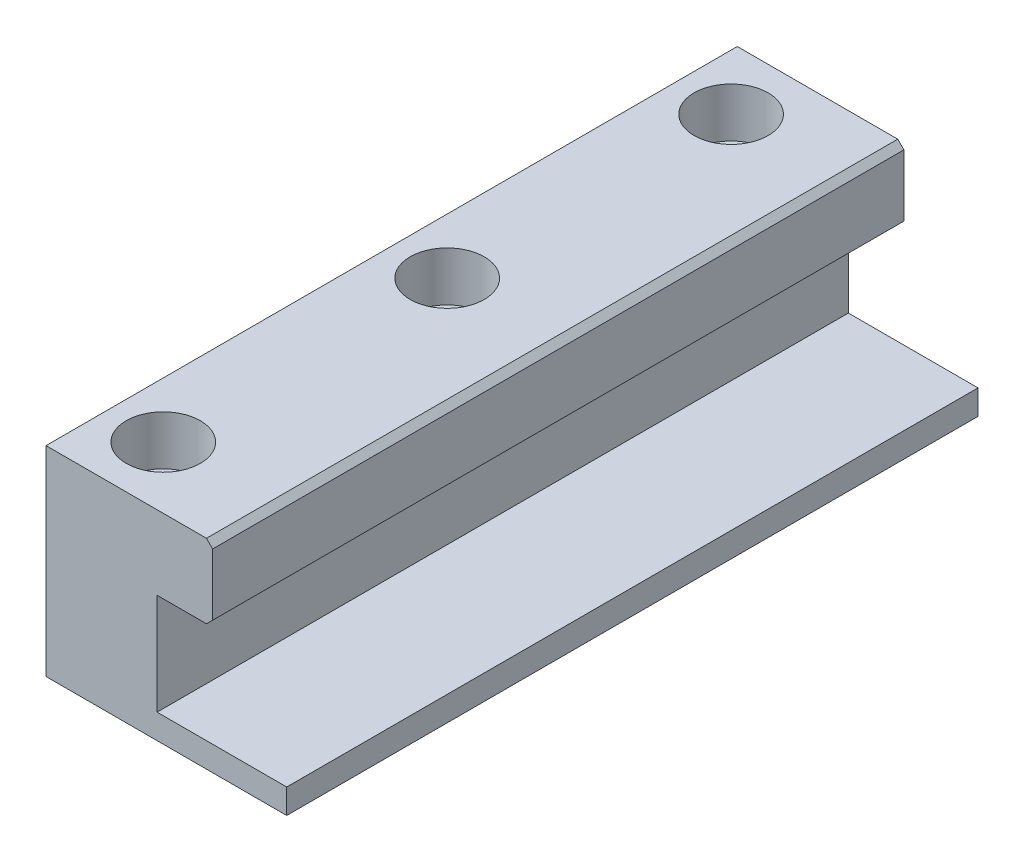
ISO-10303-21;
HEADER;
FILE_DESCRIPTION(('STEP AP214'),'2;1');
FILE_NAME('part.step','',(''),(''),'','','');
FILE_SCHEMA(('AUTOMOTIVE_DESIGN { 1 0 10303 214 1 1 1 1 }'));
ENDSEC;
DATA;
#1=APPLICATION_CONTEXT('core data for automotive mechanical design processes');
#2=APPLICATION_PROTOCOL_DEFINITION('international standard','automotive_design',2000,#1);
#3=PRODUCT_CONTEXT('',#1,'mechanical');
#4=PRODUCT('Part','Part','',(#3));
#5=PRODUCT_RELATED_PRODUCT_CATEGORY('part','',(#4));
#6=PRODUCT_DEFINITION_FORMATION('','',#4);
#7=PRODUCT_DEFINITION_CONTEXT('part definition',#1,'design');
#8=PRODUCT_DEFINITION('design','',#6,#7);
#9=PRODUCT_DEFINITION_SHAPE('','',#8);
#10=(LENGTH_UNIT() NAMED_UNIT(*) SI_UNIT(.MILLI.,.METRE.));
#11=(NAMED_UNIT(*) PLANE_ANGLE_UNIT() SI_UNIT($,.RADIAN.));
#12=(NAMED_UNIT(*) SI_UNIT($,.STERADIAN.) SOLID_ANGLE_UNIT());
#13=UNCERTAINTY_MEASURE_WITH_UNIT(LENGTH_MEASURE(1.E-05),#10,'distance_accuracy_value','');
#14=(GEOMETRIC_REPRESENTATION_CONTEXT(3) GLOBAL_UNCERTAINTY_ASSIGNED_CONTEXT((#13)) GLOBAL_UNIT_ASSIGNED_CONTEXT((#10,
#11,#12)) REPRESENTATION_CONTEXT('',''));
#15=CARTESIAN_POINT('',(0.,0.,0.));
#16=DIRECTION('',(0.,0.,1.));
#17=DIRECTION('',(1.,0.,0.));
#18=AXIS2_PLACEMENT_3D('',#15,#16,#17);
#19=CARTESIAN_POINT('',(13.25,15.95,0.));
#20=DIRECTION('',(0.707106781186546,0.707106781186549,0.));
#21=DIRECTION('',(-0.707106781186549,0.707106781186546,0.));
#22=AXIS2_PLACEMENT_3D('',#19,#20,#21);
#23=PLANE('',#22);
#24=DIRECTION('',(-0.707106781186549,0.707106781186546,0.));
#25=VECTOR('',#24,1.);
#26=CARTESIAN_POINT('',(13.25,15.95,28.));
#27=LINE('',#26,#25);
#28=CARTESIAN_POINT('',(13.,16.2,28.));
#29=VERTEX_POINT('',#28);
#30=CARTESIAN_POINT('',(13.5,15.7,28.));
#31=VERTEX_POINT('',#30);
#32=EDGE_CURVE('E140',#29,#31,#27,.F.);
#33=ORIENTED_EDGE('',*,*,#32,.T.);
#34=DIRECTION('',(0.,0.,-1.));
#35=VECTOR('',#34,1.);
#36=CARTESIAN_POINT('',(13.5,15.7,0.));
#37=LINE('',#36,#35);
#38=CARTESIAN_POINT('',(13.5,15.7,-28.));
#39=VERTEX_POINT('',#38);
#40=EDGE_CURVE('E111',#39,#31,#37,.F.);
#41=ORIENTED_EDGE('',*,*,#40,.F.);
#42=DIRECTION('',(-0.707106781186549,0.707106781186546,0.));
#43=VECTOR('',#42,1.);
#44=CARTESIAN_POINT('',(13.25,15.95,-28.));
#45=LINE('',#44,#43);
#46=CARTESIAN_POINT('',(13.,16.2,-28.));
#47=VERTEX_POINT('',#46);
#48=EDGE_CURVE('E142',#39,#47,#45,.T.);
#49=ORIENTED_EDGE('',*,*,#48,.T.);
#50=DIRECTION('',(0.,0.,1.));
#51=VECTOR('',#50,1.);
#52=CARTESIAN_POINT('',(13.,16.2,0.));
#53=LINE('',#52,#51);
#54=EDGE_CURVE('E135',#29,#47,#53,.F.);
#55=ORIENTED_EDGE('',*,*,#54,.F.);
#56=EDGE_LOOP('',(#33,#41,#49,#55));
#57=FACE_BOUND('',#56,.T.);
#58=ADVANCED_FACE('F17',(#57),#23,.T.);
#59=CARTESIAN_POINT('',(13.25,10.45,0.));
#60=DIRECTION('',(0.707106781186548,-0.707106781186548,0.));
#61=DIRECTION('',(0.707106781186548,0.707106781186548,0.));
#62=AXIS2_PLACEMENT_3D('',#59,#60,#61);
#63=PLANE('',#62);
#64=DIRECTION('',(0.707106781186548,0.707106781186548,0.));
#65=VECTOR('',#64,1.);
#66=CARTESIAN_POINT('',(13.25,10.45,28.));
#67=LINE('',#66,#65);
#68=CARTESIAN_POINT('',(13.5,10.7,28.));
#69=VERTEX_POINT('',#68);
#70=CARTESIAN_POINT('',(13.,10.2,28.));
#71=VERTEX_POINT('',#70);
#72=EDGE_CURVE('E92',#69,#71,#67,.F.);
#73=ORIENTED_EDGE('',*,*,#72,.T.);
#74=DIRECTION('',(0.,0.,-1.));
#75=VECTOR('',#74,1.);
#76=CARTESIAN_POINT('',(13.,10.2,0.));
#77=LINE('',#76,#75);
#78=CARTESIAN_POINT('',(13.,10.2,-28.));
#79=VERTEX_POINT('',#78);
#80=EDGE_CURVE('E132',#79,#71,#77,.F.);
#81=ORIENTED_EDGE('',*,*,#80,.F.);
#82=DIRECTION('',(0.707106781186548,0.707106781186548,0.));
#83=VECTOR('',#82,1.);
#84=CARTESIAN_POINT('',(13.25,10.45,-28.));
#85=LINE('',#84,#83);
#86=CARTESIAN_POINT('',(13.5,10.7,-28.));
#87=VERTEX_POINT('',#86);
#88=EDGE_CURVE('E104',#79,#87,#85,.T.);
#89=ORIENTED_EDGE('',*,*,#88,.T.);
#90=DIRECTION('',(0.,0.,-1.));
#91=VECTOR('',#90,1.);
#92=CARTESIAN_POINT('',(13.5,10.7,0.));
#93=LINE('',#92,#91);
#94=EDGE_CURVE('E103',#69,#87,#93,.T.);
#95=ORIENTED_EDGE('',*,*,#94,.F.);
#96=EDGE_LOOP('',(#73,#81,#89,#95));
#97=FACE_BOUND('',#96,.T.);
#98=ADVANCED_FACE('F107',(#97),#63,.T.);
#99=CARTESIAN_POINT('',(4.5,14.2,-23.));
#100=DIRECTION('',(0.,1.,0.));
#101=DIRECTION('',(-1.,0.,0.));
#102=AXIS2_PLACEMENT_3D('',#99,#100,#101);
#103=CYLINDRICAL_SURFACE('',#102,3.);
#104=CARTESIAN_POINT('',(4.5,12.2,-23.));
#105=DIRECTION('',(0.,1.,0.));
#106=DIRECTION('',(-1.,0.,0.));
#107=AXIS2_PLACEMENT_3D('',#104,#105,#106);
#108=CIRCLE('',#107,3.);
#109=CARTESIAN_POINT('',(1.5,12.2,-23.));
#110=VERTEX_POINT('',#109);
#111=EDGE_CURVE('E128',#110,#110,#108,.T.);
#112=ORIENTED_EDGE('',*,*,#111,.F.);
#113=EDGE_LOOP('',(#112));
#114=FACE_BOUND('',#113,.T.);
#115=CARTESIAN_POINT('',(4.5,16.2,-23.));
#116=DIRECTION('',(0.,1.,0.));
#117=DIRECTION('',(-1.,0.,0.));
#118=AXIS2_PLACEMENT_3D('',#115,#116,#117);
#119=CIRCLE('',#118,3.);
#120=CARTESIAN_POINT('',(1.5,16.2,-23.));
#121=VERTEX_POINT('',#120);
#122=EDGE_CURVE('E20',#121,#121,#119,.F.);
#123=ORIENTED_EDGE('',*,*,#122,.F.);
#124=EDGE_LOOP('',(#123));
#125=FACE_BOUND('',#124,.T.);
#126=ADVANCED_FACE('F176',(#114,#125),#103,.F.);
#127=CARTESIAN_POINT('',(4.5,14.2,0.));
#128=DIRECTION('',(0.,1.,0.));
#129=DIRECTION('',(-1.,0.,0.));
#130=AXIS2_PLACEMENT_3D('',#127,#128,#129);
#131=CYLINDRICAL_SURFACE('',#130,3.);
#132=CARTESIAN_POINT('',(4.5,12.2,0.));
#133=DIRECTION('',(0.,1.,0.));
#134=DIRECTION('',(-1.,0.,0.));
#135=AXIS2_PLACEMENT_3D('',#132,#133,#134);
#136=CIRCLE('',#135,3.);
#137=CARTESIAN_POINT('',(1.5,12.2,0.));
#138=VERTEX_POINT('',#137);
#139=EDGE_CURVE('E122',#138,#138,#136,.T.);
#140=ORIENTED_EDGE('',*,*,#139,.F.);
#141=EDGE_LOOP('',(#140));
#142=FACE_BOUND('',#141,.T.);
#143=CARTESIAN_POINT('',(4.5,16.2,0.));
#144=DIRECTION('',(0.,1.,0.));
#145=DIRECTION('',(-1.,0.,0.));
#146=AXIS2_PLACEMENT_3D('',#143,#144,#145);
#147=CIRCLE('',#146,3.);
#148=CARTESIAN_POINT('',(1.5,16.2,0.));
#149=VERTEX_POINT('',#148);
#150=EDGE_CURVE('E166',#149,#149,#147,.F.);
#151=ORIENTED_EDGE('',*,*,#150,.F.);
#152=EDGE_LOOP('',(#151));
#153=FACE_BOUND('',#152,.T.);
#154=ADVANCED_FACE('F178',(#142,#153),#131,.F.);
#155=CARTESIAN_POINT('',(4.5,14.2,23.));
#156=DIRECTION('',(0.,1.,0.));
#157=DIRECTION('',(-1.,0.,0.));
#158=AXIS2_PLACEMENT_3D('',#155,#156,#157);
#159=CYLINDRICAL_SURFACE('',#158,3.);
#160=CARTESIAN_POINT('',(4.5,12.2,23.));
#161=DIRECTION('',(0.,1.,0.));
#162=DIRECTION('',(-1.,0.,0.));
#163=AXIS2_PLACEMENT_3D('',#160,#161,#162);
#164=CIRCLE('',#163,3.);
#165=CARTESIAN_POINT('',(1.5,12.2,23.));
#166=VERTEX_POINT('',#165);
#167=EDGE_CURVE('E117',#166,#166,#164,.T.);
#168=ORIENTED_EDGE('',*,*,#167,.F.);
#169=EDGE_LOOP('',(#168));
#170=FACE_BOUND('',#169,.T.);
#171=CARTESIAN_POINT('',(4.5,16.2,23.));
#172=DIRECTION('',(0.,1.,0.));
#173=DIRECTION('',(-1.,0.,0.));
#174=AXIS2_PLACEMENT_3D('',#171,#172,#173);
#175=CIRCLE('',#174,3.);
#176=CARTESIAN_POINT('',(1.5,16.2,23.));
#177=VERTEX_POINT('',#176);
#178=EDGE_CURVE('E134',#177,#177,#175,.F.);
#179=ORIENTED_EDGE('',*,*,#178,.F.);
#180=EDGE_LOOP('',(#179));
#181=FACE_BOUND('',#180,.T.);
#182=ADVANCED_FACE('F186',(#170,#181),#159,.F.);
#183=CARTESIAN_POINT('',(13.5,16.2,0.));
#184=DIRECTION('',(1.,0.,0.));
#185=DIRECTION('',(0.,0.,-1.));
#186=AXIS2_PLACEMENT_3D('',#183,#184,#185);
#187=PLANE('',#186);
#188=ORIENTED_EDGE('',*,*,#40,.T.);
#189=DIRECTION('',(0.,1.,0.));
#190=VECTOR('',#189,1.);
#191=CARTESIAN_POINT('',(13.5,6.81641791044776,28.));
#192=LINE('',#191,#190);
#193=EDGE_CURVE('E100',#69,#31,#192,.T.);
#194=ORIENTED_EDGE('',*,*,#193,.F.);
#195=ORIENTED_EDGE('',*,*,#94,.T.);
#196=DIRECTION('',(0.,1.,0.));
#197=VECTOR('',#196,1.);
#198=CARTESIAN_POINT('',(13.5,6.81641791044776,-28.));
#199=LINE('',#198,#197);
#200=EDGE_CURVE('E400',#87,#39,#199,.T.);
#201=ORIENTED_EDGE('',*,*,#200,.T.);
#202=EDGE_LOOP('',(#188,#194,#195,#201));
#203=FACE_BOUND('',#202,.T.);
#204=ADVANCED_FACE('F114',(#203),#187,.T.);
#205=CARTESIAN_POINT('',(0.,16.2,0.));
#206=DIRECTION('',(0.,1.,0.));
#207=DIRECTION('',(0.,0.,1.));
#208=AXIS2_PLACEMENT_3D('',#205,#206,#207);
#209=PLANE('',#208);
#210=ORIENTED_EDGE('',*,*,#178,.T.);
#211=EDGE_LOOP('',(#210));
#212=FACE_BOUND('',#211,.T.);
#213=ORIENTED_EDGE('',*,*,#150,.T.);
#214=EDGE_LOOP('',(#213));
#215=FACE_BOUND('',#214,.T.);
#216=ORIENTED_EDGE('',*,*,#122,.T.);
#217=EDGE_LOOP('',(#216));
#218=FACE_BOUND('',#217,.T.);
#219=DIRECTION('',(0.,0.,1.));
#220=VECTOR('',#219,1.);
#221=CARTESIAN_POINT('',(0.,16.2,0.));
#222=LINE('',#221,#220);
#223=CARTESIAN_POINT('',(0.,16.2,28.));
#224=VERTEX_POINT('',#223);
#225=CARTESIAN_POINT('',(0.,16.2,-28.));
#226=VERTEX_POINT('',#225);
#227=EDGE_CURVE('E396',#224,#226,#222,.F.);
#228=ORIENTED_EDGE('',*,*,#227,.F.);
#229=DIRECTION('',(1.,0.,0.));
#230=VECTOR('',#229,1.);
#231=CARTESIAN_POINT('',(8.39925373134329,16.2,28.));
#232=LINE('',#231,#230);
#233=EDGE_CURVE('E116',#29,#224,#232,.F.);
#234=ORIENTED_EDGE('',*,*,#233,.F.);
#235=ORIENTED_EDGE('',*,*,#54,.T.);
#236=DIRECTION('',(1.,0.,0.));
#237=VECTOR('',#236,1.);
#238=CARTESIAN_POINT('',(8.39925373134328,16.2,-28.));
#239=LINE('',#238,#237);
#240=EDGE_CURVE('E398',#47,#226,#239,.F.);
#241=ORIENTED_EDGE('',*,*,#240,.T.);
#242=EDGE_LOOP('',(#228,#234,#235,#241));
#243=FACE_BOUND('',#242,.T.);
#244=ADVANCED_FACE('F173',(#212,#215,#218,#243),#209,.T.);
#245=CARTESIAN_POINT('',(9.,10.2,0.));
#246=DIRECTION('',(1.,0.,0.));
#247=DIRECTION('',(0.,0.,-1.));
#248=AXIS2_PLACEMENT_3D('',#245,#246,#247);
#249=PLANE('',#248);
#250=DIRECTION('',(0.,1.,0.));
#251=VECTOR('',#250,1.);
#252=CARTESIAN_POINT('',(9.,6.81641791044776,-28.));
#253=LINE('',#252,#251);
#254=CARTESIAN_POINT('',(9.,2.,-28.));
#255=VERTEX_POINT('',#254);
#256=CARTESIAN_POINT('',(9.,10.2,-28.));
#257=VERTEX_POINT('',#256);
#258=EDGE_CURVE('E420',#255,#257,#253,.T.);
#259=ORIENTED_EDGE('',*,*,#258,.T.);
#260=DIRECTION('',(0.,0.,-1.));
#261=VECTOR('',#260,1.);
#262=CARTESIAN_POINT('',(9.,10.2,0.));
#263=LINE('',#262,#261);
#264=CARTESIAN_POINT('',(9.,10.2,28.));
#265=VERTEX_POINT('',#264);
#266=EDGE_CURVE('E129',#265,#257,#263,.T.);
#267=ORIENTED_EDGE('',*,*,#266,.F.);
#268=DIRECTION('',(0.,1.,0.));
#269=VECTOR('',#268,1.);
#270=CARTESIAN_POINT('',(9.,6.81641791044776,28.));
#271=LINE('',#270,#269);
#272=CARTESIAN_POINT('',(9.,2.,28.));
#273=VERTEX_POINT('',#272);
#274=EDGE_CURVE('E406',#273,#265,#271,.T.);
#275=ORIENTED_EDGE('',*,*,#274,.F.);
#276=DIRECTION('',(0.,0.,1.));
#277=VECTOR('',#276,1.);
#278=CARTESIAN_POINT('',(9.,2.,0.));
#279=LINE('',#278,#277);
#280=EDGE_CURVE('E126',#255,#273,#279,.T.);
#281=ORIENTED_EDGE('',*,*,#280,.F.);
#282=EDGE_LOOP('',(#259,#267,#275,#281));
#283=FACE_BOUND('',#282,.T.);
#284=ADVANCED_FACE('F242',(#283),#249,.T.);
#285=CARTESIAN_POINT('',(13.5,10.2,0.));
#286=DIRECTION('',(0.,-1.,0.));
#287=DIRECTION('',(0.,0.,-1.));
#288=AXIS2_PLACEMENT_3D('',#285,#286,#287);
#289=PLANE('',#288);
#290=ORIENTED_EDGE('',*,*,#266,.T.);
#291=DIRECTION('',(1.,0.,0.));
#292=VECTOR('',#291,1.);
#293=CARTESIAN_POINT('',(8.39925373134328,10.2,-28.));
#294=LINE('',#293,#292);
#295=EDGE_CURVE('E423',#257,#79,#294,.T.);
#296=ORIENTED_EDGE('',*,*,#295,.T.);
#297=ORIENTED_EDGE('',*,*,#80,.T.);
#298=DIRECTION('',(1.,0.,0.));
#299=VECTOR('',#298,1.);
#300=CARTESIAN_POINT('',(8.39925373134329,10.2,28.));
#301=LINE('',#300,#299);
#302=EDGE_CURVE('E102',#265,#71,#301,.T.);
#303=ORIENTED_EDGE('',*,*,#302,.F.);
#304=EDGE_LOOP('',(#290,#296,#297,#303));
#305=FACE_BOUND('',#304,.T.);
#306=ADVANCED_FACE('F238',(#305),#289,.T.);
#307=CARTESIAN_POINT('',(9.,2.,0.));
#308=DIRECTION('',(0.,1.,0.));
#309=DIRECTION('',(0.,0.,1.));
#310=AXIS2_PLACEMENT_3D('',#307,#308,#309);
#311=PLANE('',#310);
#312=DIRECTION('',(1.,0.,0.));
#313=VECTOR('',#312,1.);
#314=CARTESIAN_POINT('',(8.39925373134328,2.,-28.));
#315=LINE('',#314,#313);
#316=CARTESIAN_POINT('',(19.5,2.,-28.));
#317=VERTEX_POINT('',#316);
#318=EDGE_CURVE('E418',#317,#255,#315,.F.);
#319=ORIENTED_EDGE('',*,*,#318,.T.);
#320=ORIENTED_EDGE('',*,*,#280,.T.);
#321=DIRECTION('',(1.,0.,0.));
#322=VECTOR('',#321,1.);
#323=CARTESIAN_POINT('',(8.39925373134329,2.,28.));
#324=LINE('',#323,#322);
#325=CARTESIAN_POINT('',(19.5,2.,28.));
#326=VERTEX_POINT('',#325);
#327=EDGE_CURVE('E119',#326,#273,#324,.F.);
#328=ORIENTED_EDGE('',*,*,#327,.F.);
#329=DIRECTION('',(0.,0.,-1.));
#330=VECTOR('',#329,1.);
#331=CARTESIAN_POINT('',(19.5,2.,0.));
#332=LINE('',#331,#330);
#333=EDGE_CURVE('E159',#317,#326,#332,.F.);
#334=ORIENTED_EDGE('',*,*,#333,.F.);
#335=EDGE_LOOP('',(#319,#320,#328,#334));
#336=FACE_BOUND('',#335,.T.);
#337=ADVANCED_FACE('F234',(#336),#311,.T.);
#338=CARTESIAN_POINT('',(4.5,12.2,-23.));
#339=DIRECTION('',(0.,1.,0.));
#340=DIRECTION('',(0.,0.,1.));
#341=AXIS2_PLACEMENT_3D('',#338,#339,#340);
#342=PLANE('',#341);
#343=CARTESIAN_POINT('',(4.5,12.2,-23.));
#344=DIRECTION('',(0.,1.,0.));
#345=DIRECTION('',(-1.,0.,0.));
#346=AXIS2_PLACEMENT_3D('',#343,#344,#345);
#347=CIRCLE('',#346,1.75);
#348=CARTESIAN_POINT('',(2.75,12.2,-23.));
#349=VERTEX_POINT('',#348);
#350=EDGE_CURVE('E157',#349,#349,#347,.F.);
#351=ORIENTED_EDGE('',*,*,#350,.T.);
#352=EDGE_LOOP('',(#351));
#353=FACE_BOUND('',#352,.T.);
#354=ORIENTED_EDGE('',*,*,#111,.T.);
#355=EDGE_LOOP('',(#354));
#356=FACE_BOUND('',#355,.T.);
#357=ADVANCED_FACE('F230',(#353,#356),#342,.T.);
#358=CARTESIAN_POINT('',(4.5,12.2,0.));
#359=DIRECTION('',(0.,1.,0.));
#360=DIRECTION('',(0.,0.,1.));
#361=AXIS2_PLACEMENT_3D('',#358,#359,#360);
#362=PLANE('',#361);
#363=CARTESIAN_POINT('',(4.5,12.2,0.));
#364=DIRECTION('',(0.,1.,0.));
#365=DIRECTION('',(-1.,0.,0.));
#366=AXIS2_PLACEMENT_3D('',#363,#364,#365);
#367=CIRCLE('',#366,1.75);
#368=CARTESIAN_POINT('',(2.75,12.2,0.));
#369=VERTEX_POINT('',#368);
#370=EDGE_CURVE('E154',#369,#369,#367,.F.);
#371=ORIENTED_EDGE('',*,*,#370,.T.);
#372=EDGE_LOOP('',(#371));
#373=FACE_BOUND('',#372,.T.);
#374=ORIENTED_EDGE('',*,*,#139,.T.);
#375=EDGE_LOOP('',(#374));
#376=FACE_BOUND('',#375,.T.);
#377=ADVANCED_FACE('F226',(#373,#376),#362,.T.);
#378=CARTESIAN_POINT('',(4.5,12.2,23.));
#379=DIRECTION('',(0.,1.,0.));
#380=DIRECTION('',(0.,0.,1.));
#381=AXIS2_PLACEMENT_3D('',#378,#379,#380);
#382=PLANE('',#381);
#383=CARTESIAN_POINT('',(4.5,12.2,23.));
#384=DIRECTION('',(0.,1.,0.));
#385=DIRECTION('',(-1.,0.,0.));
#386=AXIS2_PLACEMENT_3D('',#383,#384,#385);
#387=CIRCLE('',#386,1.75);
#388=CARTESIAN_POINT('',(2.75,12.2,23.));
#389=VERTEX_POINT('',#388);
#390=EDGE_CURVE('E150',#389,#389,#387,.F.);
#391=ORIENTED_EDGE('',*,*,#390,.T.);
#392=EDGE_LOOP('',(#391));
#393=FACE_BOUND('',#392,.T.);
#394=ORIENTED_EDGE('',*,*,#167,.T.);
#395=EDGE_LOOP('',(#394));
#396=FACE_BOUND('',#395,.T.);
#397=ADVANCED_FACE('F223',(#393,#396),#382,.T.);
#398=CARTESIAN_POINT('',(8.39925373134329,6.81641791044776,28.));
#399=DIRECTION('',(0.,0.,1.));
#400=DIRECTION('',(1.,0.,0.));
#401=AXIS2_PLACEMENT_3D('',#398,#399,#400);
#402=PLANE('',#401);
#403=ORIENTED_EDGE('',*,*,#274,.T.);
#404=ORIENTED_EDGE('',*,*,#302,.T.);
#405=ORIENTED_EDGE('',*,*,#72,.F.);
#406=ORIENTED_EDGE('',*,*,#193,.T.);
#407=ORIENTED_EDGE('',*,*,#32,.F.);
#408=ORIENTED_EDGE('',*,*,#233,.T.);
#409=DIRECTION('',(0.,1.,0.));
#410=VECTOR('',#409,1.);
#411=CARTESIAN_POINT('',(0.,0.,28.));
#412=LINE('',#411,#410);
#413=CARTESIAN_POINT('',(0.,0.,28.));
#414=VERTEX_POINT('',#413);
#415=EDGE_CURVE('E393',#414,#224,#412,.T.);
#416=ORIENTED_EDGE('',*,*,#415,.F.);
#417=DIRECTION('',(1.,0.,0.));
#418=VECTOR('',#417,1.);
#419=CARTESIAN_POINT('',(19.5,0.,28.));
#420=LINE('',#419,#418);
#421=CARTESIAN_POINT('',(19.5,0.,28.));
#422=VERTEX_POINT('',#421);
#423=EDGE_CURVE('E153',#422,#414,#420,.F.);
#424=ORIENTED_EDGE('',*,*,#423,.F.);
#425=DIRECTION('',(0.,1.,0.));
#426=VECTOR('',#425,1.);
#427=CARTESIAN_POINT('',(19.5,2.,28.));
#428=LINE('',#427,#426);
#429=EDGE_CURVE('E414',#326,#422,#428,.F.);
#430=ORIENTED_EDGE('',*,*,#429,.F.);
#431=ORIENTED_EDGE('',*,*,#327,.T.);
#432=EDGE_LOOP('',(#403,#404,#405,#406,#407,#408,#416,#424,#430,#431));
#433=FACE_BOUND('',#432,.T.);
#434=ADVANCED_FACE('F98',(#433),#402,.T.);
#435=CARTESIAN_POINT('',(0.,0.,0.));
#436=DIRECTION('',(-1.,0.,0.));
#437=DIRECTION('',(0.,0.,1.));
#438=AXIS2_PLACEMENT_3D('',#435,#436,#437);
#439=PLANE('',#438);
#440=DIRECTION('',(0.,1.,0.));
#441=VECTOR('',#440,1.);
#442=CARTESIAN_POINT('',(0.,6.81641791044776,-28.));
#443=LINE('',#442,#441);
#444=CARTESIAN_POINT('',(0.,0.,-28.));
#445=VERTEX_POINT('',#444);
#446=EDGE_CURVE('E430',#226,#445,#443,.F.);
#447=ORIENTED_EDGE('',*,*,#446,.T.);
#448=DIRECTION('',(0.,0.,-1.));
#449=VECTOR('',#448,1.);
#450=CARTESIAN_POINT('',(0.,0.,0.));
#451=LINE('',#450,#449);
#452=EDGE_CURVE('E403',#414,#445,#451,.T.);
#453=ORIENTED_EDGE('',*,*,#452,.F.);
#454=ORIENTED_EDGE('',*,*,#415,.T.);
#455=ORIENTED_EDGE('',*,*,#227,.T.);
#456=EDGE_LOOP('',(#447,#453,#454,#455));
#457=FACE_BOUND('',#456,.T.);
#458=ADVANCED_FACE('F217',(#457),#439,.T.);
#459=CARTESIAN_POINT('',(8.39925373134328,6.81641791044776,-28.));
#460=DIRECTION('',(0.,0.,1.));
#461=DIRECTION('',(1.,0.,0.));
#462=AXIS2_PLACEMENT_3D('',#459,#460,#461);
#463=PLANE('',#462);
#464=ORIENTED_EDGE('',*,*,#295,.F.);
#465=ORIENTED_EDGE('',*,*,#258,.F.);
#466=ORIENTED_EDGE('',*,*,#318,.F.);
#467=DIRECTION('',(0.,1.,0.));
#468=VECTOR('',#467,1.);
#469=CARTESIAN_POINT('',(19.5,2.,-28.));
#470=LINE('',#469,#468);
#471=CARTESIAN_POINT('',(19.5,0.,-28.));
#472=VERTEX_POINT('',#471);
#473=EDGE_CURVE('E35',#472,#317,#470,.T.);
#474=ORIENTED_EDGE('',*,*,#473,.F.);
#475=DIRECTION('',(1.,0.,0.));
#476=VECTOR('',#475,1.);
#477=CARTESIAN_POINT('',(19.5,0.,-28.));
#478=LINE('',#477,#476);
#479=EDGE_CURVE('E433',#445,#472,#478,.T.);
#480=ORIENTED_EDGE('',*,*,#479,.F.);
#481=ORIENTED_EDGE('',*,*,#446,.F.);
#482=ORIENTED_EDGE('',*,*,#240,.F.);
#483=ORIENTED_EDGE('',*,*,#48,.F.);
#484=ORIENTED_EDGE('',*,*,#200,.F.);
#485=ORIENTED_EDGE('',*,*,#88,.F.);
#486=EDGE_LOOP('',(#464,#465,#466,#474,#480,#481,#482,#483,#484,#485));
#487=FACE_BOUND('',#486,.T.);
#488=ADVANCED_FACE('F213',(#487),#463,.F.);
#489=CARTESIAN_POINT('',(19.5,2.,0.));
#490=DIRECTION('',(1.,0.,0.));
#491=DIRECTION('',(0.,0.,-1.));
#492=AXIS2_PLACEMENT_3D('',#489,#490,#491);
#493=PLANE('',#492);
#494=ORIENTED_EDGE('',*,*,#473,.T.);
#495=ORIENTED_EDGE('',*,*,#333,.T.);
#496=ORIENTED_EDGE('',*,*,#429,.T.);
#497=DIRECTION('',(0.,0.,-1.));
#498=VECTOR('',#497,1.);
#499=CARTESIAN_POINT('',(19.5,0.,0.));
#500=LINE('',#499,#498);
#501=EDGE_CURVE('E149',#472,#422,#500,.F.);
#502=ORIENTED_EDGE('',*,*,#501,.F.);
#503=EDGE_LOOP('',(#494,#495,#496,#502));
#504=FACE_BOUND('',#503,.T.);
#505=ADVANCED_FACE('F209',(#504),#493,.T.);
#506=CARTESIAN_POINT('',(4.49999999999999,-45.2710500967732,-23.));
#507=DIRECTION('',(0.,1.,0.));
#508=DIRECTION('',(-1.,0.,0.));
#509=AXIS2_PLACEMENT_3D('',#506,#507,#508);
#510=CYLINDRICAL_SURFACE('',#509,1.75);
#511=ORIENTED_EDGE('',*,*,#350,.F.);
#512=EDGE_LOOP('',(#511));
#513=FACE_BOUND('',#512,.T.);
#514=CARTESIAN_POINT('',(4.5,0.,-23.));
#515=DIRECTION('',(0.,1.,0.));
#516=DIRECTION('',(-1.,0.,0.));
#517=AXIS2_PLACEMENT_3D('',#514,#515,#516);
#518=CIRCLE('',#517,1.75);
#519=CARTESIAN_POINT('',(2.75,0.,-23.));
#520=VERTEX_POINT('',#519);
#521=EDGE_CURVE('E146',#520,#520,#518,.T.);
#522=ORIENTED_EDGE('',*,*,#521,.F.);
#523=EDGE_LOOP('',(#522));
#524=FACE_BOUND('',#523,.T.);
#525=ADVANCED_FACE('F205',(#513,#524),#510,.F.);
#526=CARTESIAN_POINT('',(4.49999999999999,-45.2710500967732,0.));
#527=DIRECTION('',(0.,1.,0.));
#528=DIRECTION('',(-1.,0.,0.));
#529=AXIS2_PLACEMENT_3D('',#526,#527,#528);
#530=CYLINDRICAL_SURFACE('',#529,1.75);
#531=ORIENTED_EDGE('',*,*,#370,.F.);
#532=EDGE_LOOP('',(#531));
#533=FACE_BOUND('',#532,.T.);
#534=CARTESIAN_POINT('',(4.5,0.,0.));
#535=DIRECTION('',(0.,1.,0.));
#536=DIRECTION('',(-1.,0.,0.));
#537=AXIS2_PLACEMENT_3D('',#534,#535,#536);
#538=CIRCLE('',#537,1.75);
#539=CARTESIAN_POINT('',(2.75,0.,0.));
#540=VERTEX_POINT('',#539);
#541=EDGE_CURVE('E26',#540,#540,#538,.T.);
#542=ORIENTED_EDGE('',*,*,#541,.F.);
#543=EDGE_LOOP('',(#542));
#544=FACE_BOUND('',#543,.T.);
#545=ADVANCED_FACE('F198',(#533,#544),#530,.F.);
#546=CARTESIAN_POINT('',(4.49999999999999,-45.2710500967732,23.));
#547=DIRECTION('',(0.,1.,0.));
#548=DIRECTION('',(-1.,0.,0.));
#549=AXIS2_PLACEMENT_3D('',#546,#547,#548);
#550=CYLINDRICAL_SURFACE('',#549,1.75);
#551=ORIENTED_EDGE('',*,*,#390,.F.);
#552=EDGE_LOOP('',(#551));
#553=FACE_BOUND('',#552,.T.);
#554=CARTESIAN_POINT('',(4.5,0.,23.));
#555=DIRECTION('',(0.,1.,0.));
#556=DIRECTION('',(-1.,0.,0.));
#557=AXIS2_PLACEMENT_3D('',#554,#555,#556);
#558=CIRCLE('',#557,1.75);
#559=CARTESIAN_POINT('',(2.75,0.,23.));
#560=VERTEX_POINT('',#559);
#561=EDGE_CURVE('E11',#560,#560,#558,.T.);
#562=ORIENTED_EDGE('',*,*,#561,.F.);
#563=EDGE_LOOP('',(#562));
#564=FACE_BOUND('',#563,.T.);
#565=ADVANCED_FACE('F192',(#553,#564),#550,.F.);
#566=CARTESIAN_POINT('',(19.5,0.,0.));
#567=DIRECTION('',(0.,-1.,0.));
#568=DIRECTION('',(0.,0.,-1.));
#569=AXIS2_PLACEMENT_3D('',#566,#567,#568);
#570=PLANE('',#569);
#571=ORIENTED_EDGE('',*,*,#561,.T.);
#572=EDGE_LOOP('',(#571));
#573=FACE_BOUND('',#572,.T.);
#574=ORIENTED_EDGE('',*,*,#541,.T.);
#575=EDGE_LOOP('',(#574));
#576=FACE_BOUND('',#575,.T.);
#577=ORIENTED_EDGE('',*,*,#521,.T.);
#578=EDGE_LOOP('',(#577));
#579=FACE_BOUND('',#578,.T.);
#580=ORIENTED_EDGE('',*,*,#479,.T.);
#581=ORIENTED_EDGE('',*,*,#501,.T.);
#582=ORIENTED_EDGE('',*,*,#423,.T.);
#583=ORIENTED_EDGE('',*,*,#452,.T.);
#584=EDGE_LOOP('',(#580,#581,#582,#583));
#585=FACE_BOUND('',#584,.T.);
#586=ADVANCED_FACE('F190',(#573,#576,#579,#585),#570,.T.);
#587=CLOSED_SHELL('',(#58,#98,#126,#154,#182,#204,#244,#284,#306,#337,#357,#377,#397,#434,#458,
#488,#505,#525,#545,#565,#586));
#588=MANIFOLD_SOLID_BREP('B1',#587);
#589=ADVANCED_BREP_SHAPE_REPRESENTATION('',(#18,#588),#14);
#590=SHAPE_DEFINITION_REPRESENTATION(#9,#589);
ENDSEC;
END-ISO-10303-21;
